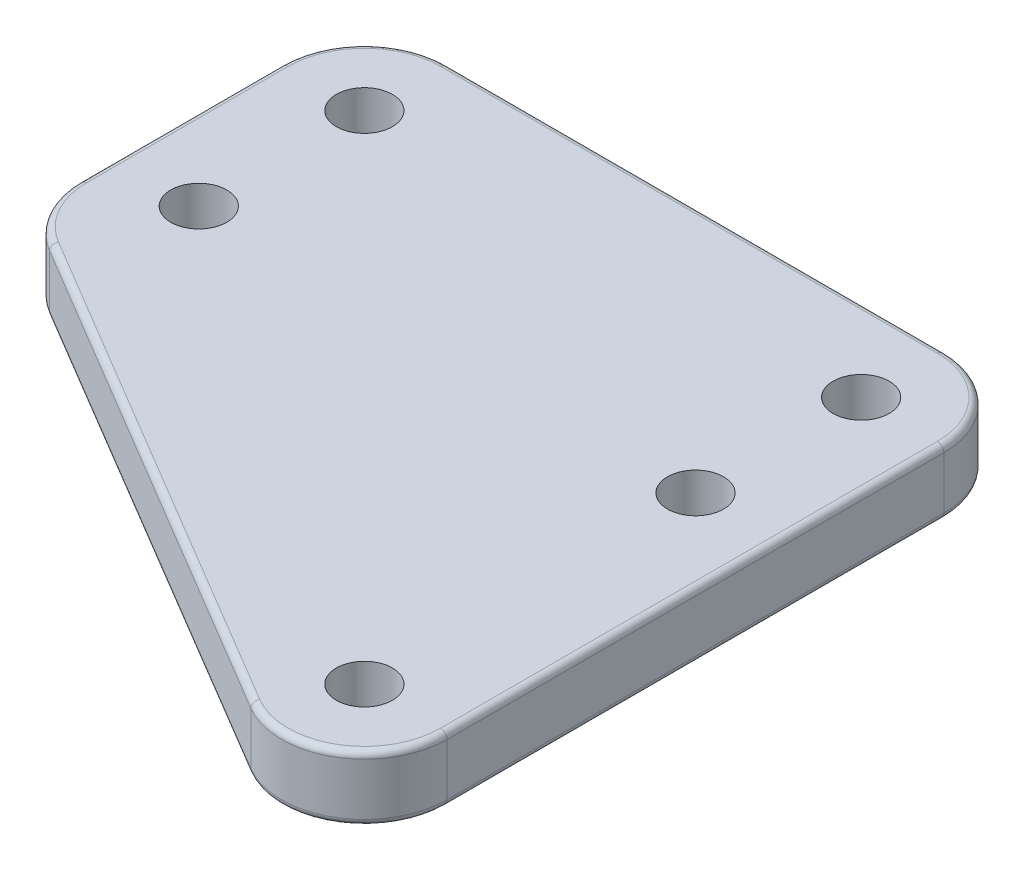
ISO-10303-21;
HEADER;
FILE_DESCRIPTION(('STEP AP214'),'2;1');
FILE_NAME('part.step','',(''),(''),'','','');
FILE_SCHEMA(('AUTOMOTIVE_DESIGN { 1 0 10303 214 1 1 1 1 }'));
ENDSEC;
DATA;
#1=APPLICATION_CONTEXT('core data for automotive mechanical design processes');
#2=APPLICATION_PROTOCOL_DEFINITION('international standard','automotive_design',2000,#1);
#3=PRODUCT_CONTEXT('',#1,'mechanical');
#4=PRODUCT('Part','Part','',(#3));
#5=PRODUCT_RELATED_PRODUCT_CATEGORY('part','',(#4));
#6=PRODUCT_DEFINITION_FORMATION('','',#4);
#7=PRODUCT_DEFINITION_CONTEXT('part definition',#1,'design');
#8=PRODUCT_DEFINITION('design','',#6,#7);
#9=PRODUCT_DEFINITION_SHAPE('','',#8);
#10=(LENGTH_UNIT() NAMED_UNIT(*) SI_UNIT(.MILLI.,.METRE.));
#11=(NAMED_UNIT(*) PLANE_ANGLE_UNIT() SI_UNIT($,.RADIAN.));
#12=(NAMED_UNIT(*) SI_UNIT($,.STERADIAN.) SOLID_ANGLE_UNIT());
#13=UNCERTAINTY_MEASURE_WITH_UNIT(LENGTH_MEASURE(1.E-05),#10,'distance_accuracy_value','');
#14=(GEOMETRIC_REPRESENTATION_CONTEXT(3) GLOBAL_UNCERTAINTY_ASSIGNED_CONTEXT((#13)) GLOBAL_UNIT_ASSIGNED_CONTEXT((#10,
#11,#12)) REPRESENTATION_CONTEXT('',''));
#15=CARTESIAN_POINT('',(0.,0.,0.));
#16=DIRECTION('',(0.,0.,1.));
#17=DIRECTION('',(1.,0.,0.));
#18=AXIS2_PLACEMENT_3D('',#15,#16,#17);
#19=CARTESIAN_POINT('',(0.,5.,0.));
#20=DIRECTION('',(0.,0.,1.));
#21=DIRECTION('',(1.,0.,0.));
#22=AXIS2_PLACEMENT_3D('',#19,#20,#21);
#23=PLANE('',#22);
#24=DIRECTION('',(0.,-1.,0.));
#25=VECTOR('',#24,1.);
#26=CARTESIAN_POINT('',(-6.35,0.,0.));
#27=LINE('',#26,#25);
#28=CARTESIAN_POINT('',(-6.35,4.5,0.));
#29=VERTEX_POINT('',#28);
#30=CARTESIAN_POINT('',(-6.35,0.5,0.));
#31=VERTEX_POINT('',#30);
#32=EDGE_CURVE('E297',#29,#31,#27,.T.);
#33=ORIENTED_EDGE('',*,*,#32,.T.);
#34=DIRECTION('',(-1.,0.,0.));
#35=VECTOR('',#34,1.);
#36=CARTESIAN_POINT('',(0.,0.5,0.));
#37=LINE('',#36,#35);
#38=CARTESIAN_POINT('',(-44.45,0.5,0.));
#39=VERTEX_POINT('',#38);
#40=EDGE_CURVE('E214',#31,#39,#37,.T.);
#41=ORIENTED_EDGE('',*,*,#40,.T.);
#42=DIRECTION('',(0.,-1.,0.));
#43=VECTOR('',#42,1.);
#44=CARTESIAN_POINT('',(-44.45,5.,0.));
#45=LINE('',#44,#43);
#46=CARTESIAN_POINT('',(-44.45,4.5,0.));
#47=VERTEX_POINT('',#46);
#48=EDGE_CURVE('E303',#39,#47,#45,.F.);
#49=ORIENTED_EDGE('',*,*,#48,.T.);
#50=DIRECTION('',(-1.,0.,0.));
#51=VECTOR('',#50,1.);
#52=CARTESIAN_POINT('',(-6.35,4.5,0.));
#53=LINE('',#52,#51);
#54=EDGE_CURVE('E212',#47,#29,#53,.F.);
#55=ORIENTED_EDGE('',*,*,#54,.T.);
#56=EDGE_LOOP('',(#33,#41,#49,#55));
#57=FACE_BOUND('',#56,.T.);
#58=ADVANCED_FACE('F40',(#57),#23,.F.);
#59=CARTESIAN_POINT('',(-50.8,5.,0.));
#60=DIRECTION('',(1.,0.,0.));
#61=DIRECTION('',(0.,0.,-1.));
#62=AXIS2_PLACEMENT_3D('',#59,#60,#61);
#63=PLANE('',#62);
#64=DIRECTION('',(0.,-1.,0.));
#65=VECTOR('',#64,1.);
#66=CARTESIAN_POINT('',(-50.8,5.,6.35));
#67=LINE('',#66,#65);
#68=CARTESIAN_POINT('',(-50.8,4.5,6.35));
#69=VERTEX_POINT('',#68);
#70=CARTESIAN_POINT('',(-50.8,0.5,6.35));
#71=VERTEX_POINT('',#70);
#72=EDGE_CURVE('E319',#69,#71,#67,.T.);
#73=ORIENTED_EDGE('',*,*,#72,.T.);
#74=DIRECTION('',(0.,0.,1.));
#75=VECTOR('',#74,1.);
#76=CARTESIAN_POINT('',(-50.8,0.5,0.));
#77=LINE('',#76,#75);
#78=CARTESIAN_POINT('',(-50.8,0.5,21.7885689170038));
#79=VERTEX_POINT('',#78);
#80=EDGE_CURVE('E206',#71,#79,#77,.T.);
#81=ORIENTED_EDGE('',*,*,#80,.T.);
#82=DIRECTION('',(0.,-1.,0.));
#83=VECTOR('',#82,1.);
#84=CARTESIAN_POINT('',(-50.8,5.,21.7885689170038));
#85=LINE('',#84,#83);
#86=CARTESIAN_POINT('',(-50.8,4.5,21.7885689170038));
#87=VERTEX_POINT('',#86);
#88=EDGE_CURVE('E316',#79,#87,#85,.F.);
#89=ORIENTED_EDGE('',*,*,#88,.T.);
#90=DIRECTION('',(0.,0.,1.));
#91=VECTOR('',#90,1.);
#92=CARTESIAN_POINT('',(-50.8,4.5,6.35));
#93=LINE('',#92,#91);
#94=EDGE_CURVE('E204',#87,#69,#93,.F.);
#95=ORIENTED_EDGE('',*,*,#94,.T.);
#96=EDGE_LOOP('',(#73,#81,#89,#95));
#97=FACE_BOUND('',#96,.T.);
#98=ADVANCED_FACE('F356',(#97),#63,.F.);
#99=CARTESIAN_POINT('',(-24.4348866044378,5.,41.0816587981342));
#100=DIRECTION('',(0.511198332858832,0.,-0.859462776670608));
#101=DIRECTION('',(-0.859462776670608,0.,-0.511198332858832));
#102=AXIS2_PLACEMENT_3D('',#99,#100,#101);
#103=PLANE('',#102);
#104=DIRECTION('',(0.,-1.,0.));
#105=VECTOR('',#104,1.);
#106=CARTESIAN_POINT('',(-47.6961094136536,5.,27.2461575488622));
#107=LINE('',#106,#105);
#108=CARTESIAN_POINT('',(-47.6961094136536,4.5,27.2461575488622));
#109=VERTEX_POINT('',#108);
#110=CARTESIAN_POINT('',(-47.6961094136536,0.5,27.2461575488622));
#111=VERTEX_POINT('',#110);
#112=EDGE_CURVE('E322',#109,#111,#107,.T.);
#113=ORIENTED_EDGE('',*,*,#112,.T.);
#114=DIRECTION('',(0.859462776670608,0.,0.511198332858832));
#115=VECTOR('',#114,1.);
#116=CARTESIAN_POINT('',(-24.4348866044378,0.5,41.0816587981342));
#117=LINE('',#116,#115);
#118=CARTESIAN_POINT('',(-9.59610941365358,0.5,49.9075886318584));
#119=VERTEX_POINT('',#118);
#120=EDGE_CURVE('E11',#111,#119,#117,.T.);
#121=ORIENTED_EDGE('',*,*,#120,.T.);
#122=DIRECTION('',(0.,-1.,0.));
#123=VECTOR('',#122,1.);
#124=CARTESIAN_POINT('',(-9.59610941365358,5.,49.9075886318584));
#125=LINE('',#124,#123);
#126=CARTESIAN_POINT('',(-9.59610941365358,4.5,49.9075886318584));
#127=VERTEX_POINT('',#126);
#128=EDGE_CURVE('E180',#119,#127,#125,.F.);
#129=ORIENTED_EDGE('',*,*,#128,.T.);
#130=DIRECTION('',(0.859462776670608,0.,0.511198332858832));
#131=VECTOR('',#130,1.);
#132=CARTESIAN_POINT('',(-47.6961094136536,4.5,27.2461575488622));
#133=LINE('',#132,#131);
#134=EDGE_CURVE('E49',#127,#109,#133,.F.);
#135=ORIENTED_EDGE('',*,*,#134,.T.);
#136=EDGE_LOOP('',(#113,#121,#129,#135));
#137=FACE_BOUND('',#136,.T.);
#138=ADVANCED_FACE('F366',(#137),#103,.F.);
#139=CARTESIAN_POINT('',(0.,5.,0.));
#140=DIRECTION('',(1.,0.,0.));
#141=DIRECTION('',(0.,0.,-1.));
#142=AXIS2_PLACEMENT_3D('',#139,#140,#141);
#143=PLANE('',#142);
#144=DIRECTION('',(0.,-1.,0.));
#145=VECTOR('',#144,1.);
#146=CARTESIAN_POINT('',(0.,5.,44.45));
#147=LINE('',#146,#145);
#148=CARTESIAN_POINT('',(0.,4.5,44.45));
#149=VERTEX_POINT('',#148);
#150=CARTESIAN_POINT('',(0.,0.5,44.45));
#151=VERTEX_POINT('',#150);
#152=EDGE_CURVE('E183',#149,#151,#147,.T.);
#153=ORIENTED_EDGE('',*,*,#152,.T.);
#154=DIRECTION('',(0.,0.,1.));
#155=VECTOR('',#154,1.);
#156=CARTESIAN_POINT('',(0.,0.5,6.35));
#157=LINE('',#156,#155);
#158=CARTESIAN_POINT('',(0.,0.5,6.35));
#159=VERTEX_POINT('',#158);
#160=EDGE_CURVE('E222',#151,#159,#157,.F.);
#161=ORIENTED_EDGE('',*,*,#160,.T.);
#162=DIRECTION('',(0.,-1.,0.));
#163=VECTOR('',#162,1.);
#164=CARTESIAN_POINT('',(0.,5.,6.35));
#165=LINE('',#164,#163);
#166=CARTESIAN_POINT('',(0.,4.5,6.35));
#167=VERTEX_POINT('',#166);
#168=EDGE_CURVE('E294',#159,#167,#165,.F.);
#169=ORIENTED_EDGE('',*,*,#168,.T.);
#170=DIRECTION('',(0.,0.,1.));
#171=VECTOR('',#170,1.);
#172=CARTESIAN_POINT('',(0.,4.5,0.));
#173=LINE('',#172,#171);
#174=EDGE_CURVE('E220',#167,#149,#173,.T.);
#175=ORIENTED_EDGE('',*,*,#174,.T.);
#176=EDGE_LOOP('',(#153,#161,#169,#175));
#177=FACE_BOUND('',#176,.T.);
#178=ADVANCED_FACE('F300',(#177),#143,.T.);
#179=CARTESIAN_POINT('',(-44.45,5.,6.35));
#180=DIRECTION('',(0.,-1.,0.));
#181=DIRECTION('',(0.,0.,-1.));
#182=AXIS2_PLACEMENT_3D('',#179,#180,#181);
#183=CYLINDRICAL_SURFACE('',#182,2.15);
#184=CARTESIAN_POINT('',(-44.45,5.,6.35));
#185=DIRECTION('',(0.,1.,0.));
#186=DIRECTION('',(0.,0.,1.));
#187=AXIS2_PLACEMENT_3D('',#184,#185,#186);
#188=CIRCLE('',#187,2.15);
#189=CARTESIAN_POINT('',(-44.45,5.,8.50000000000001));
#190=VERTEX_POINT('',#189);
#191=EDGE_CURVE('E309',#190,#190,#188,.T.);
#192=ORIENTED_EDGE('',*,*,#191,.T.);
#193=EDGE_LOOP('',(#192));
#194=FACE_BOUND('',#193,.T.);
#195=CARTESIAN_POINT('',(-44.45,0.,6.35));
#196=DIRECTION('',(0.,1.,0.));
#197=DIRECTION('',(0.,0.,1.));
#198=AXIS2_PLACEMENT_3D('',#195,#196,#197);
#199=CIRCLE('',#198,2.15);
#200=CARTESIAN_POINT('',(-44.45,0.,8.50000000000001));
#201=VERTEX_POINT('',#200);
#202=EDGE_CURVE('E642',#201,#201,#199,.T.);
#203=ORIENTED_EDGE('',*,*,#202,.F.);
#204=EDGE_LOOP('',(#203));
#205=FACE_BOUND('',#204,.T.);
#206=ADVANCED_FACE('F403',(#194,#205),#183,.F.);
#207=CARTESIAN_POINT('',(-6.34999999999999,5.,6.35));
#208=DIRECTION('',(0.,-1.,0.));
#209=DIRECTION('',(0.,0.,-1.));
#210=AXIS2_PLACEMENT_3D('',#207,#208,#209);
#211=CYLINDRICAL_SURFACE('',#210,2.15);
#212=CARTESIAN_POINT('',(-6.34999999999999,5.,6.35));
#213=DIRECTION('',(0.,1.,0.));
#214=DIRECTION('',(0.,0.,1.));
#215=AXIS2_PLACEMENT_3D('',#212,#213,#214);
#216=CIRCLE('',#215,2.15);
#217=CARTESIAN_POINT('',(-6.34999999999999,5.,8.50000000000001));
#218=VERTEX_POINT('',#217);
#219=EDGE_CURVE('E660',#218,#218,#216,.T.);
#220=ORIENTED_EDGE('',*,*,#219,.T.);
#221=EDGE_LOOP('',(#220));
#222=FACE_BOUND('',#221,.T.);
#223=CARTESIAN_POINT('',(-6.34999999999999,0.,6.35));
#224=DIRECTION('',(0.,1.,0.));
#225=DIRECTION('',(0.,0.,1.));
#226=AXIS2_PLACEMENT_3D('',#223,#224,#225);
#227=CIRCLE('',#226,2.15);
#228=CARTESIAN_POINT('',(-6.34999999999999,0.,8.50000000000001));
#229=VERTEX_POINT('',#228);
#230=EDGE_CURVE('E647',#229,#229,#227,.T.);
#231=ORIENTED_EDGE('',*,*,#230,.F.);
#232=EDGE_LOOP('',(#231));
#233=FACE_BOUND('',#232,.T.);
#234=ADVANCED_FACE('F406',(#222,#233),#211,.F.);
#235=CARTESIAN_POINT('',(-6.34999999999986,5.,19.05));
#236=DIRECTION('',(0.,-1.,0.));
#237=DIRECTION('',(0.,0.,-1.));
#238=AXIS2_PLACEMENT_3D('',#235,#236,#237);
#239=CYLINDRICAL_SURFACE('',#238,2.15);
#240=CARTESIAN_POINT('',(-6.34999999999986,5.,19.05));
#241=DIRECTION('',(0.,1.,0.));
#242=DIRECTION('',(0.,0.,1.));
#243=AXIS2_PLACEMENT_3D('',#240,#241,#242);
#244=CIRCLE('',#243,2.15);
#245=CARTESIAN_POINT('',(-6.34999999999986,5.,21.2));
#246=VERTEX_POINT('',#245);
#247=EDGE_CURVE('E644',#246,#246,#244,.T.);
#248=ORIENTED_EDGE('',*,*,#247,.T.);
#249=EDGE_LOOP('',(#248));
#250=FACE_BOUND('',#249,.T.);
#251=CARTESIAN_POINT('',(-6.34999999999986,0.,19.05));
#252=DIRECTION('',(0.,1.,0.));
#253=DIRECTION('',(0.,0.,1.));
#254=AXIS2_PLACEMENT_3D('',#251,#252,#253);
#255=CIRCLE('',#254,2.15);
#256=CARTESIAN_POINT('',(-6.34999999999986,0.,21.2));
#257=VERTEX_POINT('',#256);
#258=EDGE_CURVE('E651',#257,#257,#255,.T.);
#259=ORIENTED_EDGE('',*,*,#258,.F.);
#260=EDGE_LOOP('',(#259));
#261=FACE_BOUND('',#260,.T.);
#262=ADVANCED_FACE('F410',(#250,#261),#239,.F.);
#263=CARTESIAN_POINT('',(-44.4499999999999,5.,19.05));
#264=DIRECTION('',(0.,-1.,0.));
#265=DIRECTION('',(0.,0.,-1.));
#266=AXIS2_PLACEMENT_3D('',#263,#264,#265);
#267=CYLINDRICAL_SURFACE('',#266,2.15);
#268=CARTESIAN_POINT('',(-44.4499999999999,5.,19.05));
#269=DIRECTION('',(0.,1.,0.));
#270=DIRECTION('',(0.,0.,1.));
#271=AXIS2_PLACEMENT_3D('',#268,#269,#270);
#272=CIRCLE('',#271,2.15);
#273=CARTESIAN_POINT('',(-44.4499999999999,5.,21.2));
#274=VERTEX_POINT('',#273);
#275=EDGE_CURVE('E641',#274,#274,#272,.T.);
#276=ORIENTED_EDGE('',*,*,#275,.T.);
#277=EDGE_LOOP('',(#276));
#278=FACE_BOUND('',#277,.T.);
#279=CARTESIAN_POINT('',(-44.4499999999999,0.,19.05));
#280=DIRECTION('',(0.,1.,0.));
#281=DIRECTION('',(0.,0.,1.));
#282=AXIS2_PLACEMENT_3D('',#279,#280,#281);
#283=CIRCLE('',#282,2.15);
#284=CARTESIAN_POINT('',(-44.4499999999999,0.,21.2));
#285=VERTEX_POINT('',#284);
#286=EDGE_CURVE('E257',#285,#285,#283,.T.);
#287=ORIENTED_EDGE('',*,*,#286,.F.);
#288=EDGE_LOOP('',(#287));
#289=FACE_BOUND('',#288,.T.);
#290=ADVANCED_FACE('F414',(#278,#289),#267,.F.);
#291=CARTESIAN_POINT('',(-6.34999999999999,5.,44.45));
#292=DIRECTION('',(0.,-1.,0.));
#293=DIRECTION('',(0.,0.,-1.));
#294=AXIS2_PLACEMENT_3D('',#291,#292,#293);
#295=CYLINDRICAL_SURFACE('',#294,2.15);
#296=CARTESIAN_POINT('',(-6.34999999999999,5.,44.45));
#297=DIRECTION('',(0.,1.,0.));
#298=DIRECTION('',(0.,0.,1.));
#299=AXIS2_PLACEMENT_3D('',#296,#297,#298);
#300=CIRCLE('',#299,2.15);
#301=CARTESIAN_POINT('',(-6.34999999999999,5.,46.6));
#302=VERTEX_POINT('',#301);
#303=EDGE_CURVE('E304',#302,#302,#300,.T.);
#304=ORIENTED_EDGE('',*,*,#303,.T.);
#305=EDGE_LOOP('',(#304));
#306=FACE_BOUND('',#305,.T.);
#307=CARTESIAN_POINT('',(-6.34999999999999,0.,44.45));
#308=DIRECTION('',(0.,1.,0.));
#309=DIRECTION('',(0.,0.,1.));
#310=AXIS2_PLACEMENT_3D('',#307,#308,#309);
#311=CIRCLE('',#310,2.15);
#312=CARTESIAN_POINT('',(-6.34999999999999,0.,46.6));
#313=VERTEX_POINT('',#312);
#314=EDGE_CURVE('E312',#313,#313,#311,.T.);
#315=ORIENTED_EDGE('',*,*,#314,.F.);
#316=EDGE_LOOP('',(#315));
#317=FACE_BOUND('',#316,.T.);
#318=ADVANCED_FACE('F418',(#306,#317),#295,.F.);
#319=CARTESIAN_POINT('',(0.,5.,0.));
#320=DIRECTION('',(0.,1.,0.));
#321=DIRECTION('',(0.,0.,1.));
#322=AXIS2_PLACEMENT_3D('',#319,#320,#321);
#323=PLANE('',#322);
#324=DIRECTION('',(0.,0.,1.));
#325=VECTOR('',#324,1.);
#326=CARTESIAN_POINT('',(-50.3,5.,21.7885689170038));
#327=LINE('',#326,#325);
#328=CARTESIAN_POINT('',(-50.3,5.,6.35));
#329=VERTEX_POINT('',#328);
#330=CARTESIAN_POINT('',(-50.3,5.,21.7885689170038));
#331=VERTEX_POINT('',#330);
#332=EDGE_CURVE('E57',#329,#331,#327,.T.);
#333=ORIENTED_EDGE('',*,*,#332,.T.);
#334=CARTESIAN_POINT('',(-44.45,5.,21.7885689170038));
#335=DIRECTION('',(0.,1.,0.));
#336=DIRECTION('',(0.,0.,1.));
#337=AXIS2_PLACEMENT_3D('',#334,#335,#336);
#338=CIRCLE('',#337,5.85);
#339=CARTESIAN_POINT('',(-47.4405102472242,5.,26.8164261605269));
#340=VERTEX_POINT('',#339);
#341=EDGE_CURVE('E239',#331,#340,#338,.T.);
#342=ORIENTED_EDGE('',*,*,#341,.T.);
#343=DIRECTION('',(0.859462776670608,0.,0.511198332858832));
#344=VECTOR('',#343,1.);
#345=CARTESIAN_POINT('',(-9.34051024722416,5.,49.477857243523));
#346=LINE('',#345,#344);
#347=CARTESIAN_POINT('',(-9.34051024722416,5.,49.477857243523));
#348=VERTEX_POINT('',#347);
#349=EDGE_CURVE('E227',#340,#348,#346,.T.);
#350=ORIENTED_EDGE('',*,*,#349,.T.);
#351=CARTESIAN_POINT('',(-6.35,5.,44.45));
#352=DIRECTION('',(0.,1.,0.));
#353=DIRECTION('',(0.,0.,1.));
#354=AXIS2_PLACEMENT_3D('',#351,#352,#353);
#355=CIRCLE('',#354,5.85);
#356=CARTESIAN_POINT('',(-0.500000000000001,5.,44.45));
#357=VERTEX_POINT('',#356);
#358=EDGE_CURVE('E229',#348,#357,#355,.T.);
#359=ORIENTED_EDGE('',*,*,#358,.T.);
#360=DIRECTION('',(0.,0.,1.));
#361=VECTOR('',#360,1.);
#362=CARTESIAN_POINT('',(-0.5,5.,0.));
#363=LINE('',#362,#361);
#364=CARTESIAN_POINT('',(-0.5,5.,6.35));
#365=VERTEX_POINT('',#364);
#366=EDGE_CURVE('E231',#357,#365,#363,.F.);
#367=ORIENTED_EDGE('',*,*,#366,.T.);
#368=CARTESIAN_POINT('',(-6.35,5.,6.35));
#369=DIRECTION('',(0.,1.,0.));
#370=DIRECTION('',(0.,0.,1.));
#371=AXIS2_PLACEMENT_3D('',#368,#369,#370);
#372=CIRCLE('',#371,5.85);
#373=CARTESIAN_POINT('',(-6.35,5.,0.500000000000002));
#374=VERTEX_POINT('',#373);
#375=EDGE_CURVE('E233',#365,#374,#372,.T.);
#376=ORIENTED_EDGE('',*,*,#375,.T.);
#377=DIRECTION('',(-1.,0.,0.));
#378=VECTOR('',#377,1.);
#379=CARTESIAN_POINT('',(-44.45,5.,0.500000000000005));
#380=LINE('',#379,#378);
#381=CARTESIAN_POINT('',(-44.45,5.,0.500000000000005));
#382=VERTEX_POINT('',#381);
#383=EDGE_CURVE('E235',#374,#382,#380,.T.);
#384=ORIENTED_EDGE('',*,*,#383,.T.);
#385=CARTESIAN_POINT('',(-44.45,5.,6.35));
#386=DIRECTION('',(0.,1.,0.));
#387=DIRECTION('',(0.,0.,1.));
#388=AXIS2_PLACEMENT_3D('',#385,#386,#387);
#389=CIRCLE('',#388,5.85);
#390=EDGE_CURVE('E62',#382,#329,#389,.T.);
#391=ORIENTED_EDGE('',*,*,#390,.T.);
#392=EDGE_LOOP('',(#333,#342,#350,#359,#367,#376,#384,#391));
#393=FACE_BOUND('',#392,.T.);
#394=ORIENTED_EDGE('',*,*,#275,.F.);
#395=EDGE_LOOP('',(#394));
#396=FACE_BOUND('',#395,.T.);
#397=ORIENTED_EDGE('',*,*,#247,.F.);
#398=EDGE_LOOP('',(#397));
#399=FACE_BOUND('',#398,.T.);
#400=ORIENTED_EDGE('',*,*,#219,.F.);
#401=EDGE_LOOP('',(#400));
#402=FACE_BOUND('',#401,.T.);
#403=ORIENTED_EDGE('',*,*,#191,.F.);
#404=EDGE_LOOP('',(#403));
#405=FACE_BOUND('',#404,.T.);
#406=ORIENTED_EDGE('',*,*,#303,.F.);
#407=EDGE_LOOP('',(#406));
#408=FACE_BOUND('',#407,.T.);
#409=ADVANCED_FACE('F560',(#393,#396,#399,#402,#405,#408),#323,.T.);
#410=CARTESIAN_POINT('',(0.,0.,0.));
#411=DIRECTION('',(0.,1.,0.));
#412=DIRECTION('',(0.,0.,1.));
#413=AXIS2_PLACEMENT_3D('',#410,#411,#412);
#414=PLANE('',#413);
#415=DIRECTION('',(0.859462776670608,0.,0.511198332858832));
#416=VECTOR('',#415,1.);
#417=CARTESIAN_POINT('',(-24.1792874380084,0.,40.6519274097989));
#418=LINE('',#417,#416);
#419=CARTESIAN_POINT('',(-9.34051024722417,0.,49.4778572435231));
#420=VERTEX_POINT('',#419);
#421=CARTESIAN_POINT('',(-47.4405102472242,0.,26.8164261605269));
#422=VERTEX_POINT('',#421);
#423=EDGE_CURVE('E159',#420,#422,#418,.F.);
#424=ORIENTED_EDGE('',*,*,#423,.T.);
#425=CARTESIAN_POINT('',(-44.45,0.,21.7885689170038));
#426=DIRECTION('',(0.,1.,0.));
#427=DIRECTION('',(0.,0.,1.));
#428=AXIS2_PLACEMENT_3D('',#425,#426,#427);
#429=CIRCLE('',#428,5.85);
#430=CARTESIAN_POINT('',(-50.3,0.,21.7885689170038));
#431=VERTEX_POINT('',#430);
#432=EDGE_CURVE('E196',#422,#431,#429,.F.);
#433=ORIENTED_EDGE('',*,*,#432,.T.);
#434=DIRECTION('',(0.,0.,1.));
#435=VECTOR('',#434,1.);
#436=CARTESIAN_POINT('',(-50.3,0.,0.));
#437=LINE('',#436,#435);
#438=CARTESIAN_POINT('',(-50.3,0.,6.35));
#439=VERTEX_POINT('',#438);
#440=EDGE_CURVE('E194',#431,#439,#437,.F.);
#441=ORIENTED_EDGE('',*,*,#440,.T.);
#442=CARTESIAN_POINT('',(-44.45,0.,6.35));
#443=DIRECTION('',(0.,1.,0.));
#444=DIRECTION('',(0.,0.,1.));
#445=AXIS2_PLACEMENT_3D('',#442,#443,#444);
#446=CIRCLE('',#445,5.85);
#447=CARTESIAN_POINT('',(-44.45,0.,0.500000000000005));
#448=VERTEX_POINT('',#447);
#449=EDGE_CURVE('E192',#439,#448,#446,.F.);
#450=ORIENTED_EDGE('',*,*,#449,.T.);
#451=DIRECTION('',(-1.,0.,0.));
#452=VECTOR('',#451,1.);
#453=CARTESIAN_POINT('',(0.,0.,0.5));
#454=LINE('',#453,#452);
#455=CARTESIAN_POINT('',(-6.35,0.,0.500000000000002));
#456=VERTEX_POINT('',#455);
#457=EDGE_CURVE('E190',#448,#456,#454,.F.);
#458=ORIENTED_EDGE('',*,*,#457,.T.);
#459=CARTESIAN_POINT('',(-6.35,0.,6.35));
#460=DIRECTION('',(0.,1.,0.));
#461=DIRECTION('',(0.,0.,1.));
#462=AXIS2_PLACEMENT_3D('',#459,#460,#461);
#463=CIRCLE('',#462,5.85);
#464=CARTESIAN_POINT('',(-0.5,0.,6.35));
#465=VERTEX_POINT('',#464);
#466=EDGE_CURVE('E188',#456,#465,#463,.F.);
#467=ORIENTED_EDGE('',*,*,#466,.T.);
#468=DIRECTION('',(0.,0.,1.));
#469=VECTOR('',#468,1.);
#470=CARTESIAN_POINT('',(-0.500000000000001,0.,44.45));
#471=LINE('',#470,#469);
#472=CARTESIAN_POINT('',(-0.500000000000001,0.,44.45));
#473=VERTEX_POINT('',#472);
#474=EDGE_CURVE('E162',#465,#473,#471,.T.);
#475=ORIENTED_EDGE('',*,*,#474,.T.);
#476=CARTESIAN_POINT('',(-6.35,0.,44.45));
#477=DIRECTION('',(0.,1.,0.));
#478=DIRECTION('',(0.,0.,1.));
#479=AXIS2_PLACEMENT_3D('',#476,#477,#478);
#480=CIRCLE('',#479,5.85);
#481=EDGE_CURVE('E153',#473,#420,#480,.F.);
#482=ORIENTED_EDGE('',*,*,#481,.T.);
#483=EDGE_LOOP('',(#424,#433,#441,#450,#458,#467,#475,#482));
#484=FACE_BOUND('',#483,.T.);
#485=ORIENTED_EDGE('',*,*,#286,.T.);
#486=EDGE_LOOP('',(#485));
#487=FACE_BOUND('',#486,.T.);
#488=ORIENTED_EDGE('',*,*,#258,.T.);
#489=EDGE_LOOP('',(#488));
#490=FACE_BOUND('',#489,.T.);
#491=ORIENTED_EDGE('',*,*,#230,.T.);
#492=EDGE_LOOP('',(#491));
#493=FACE_BOUND('',#492,.T.);
#494=ORIENTED_EDGE('',*,*,#202,.T.);
#495=EDGE_LOOP('',(#494));
#496=FACE_BOUND('',#495,.T.);
#497=ORIENTED_EDGE('',*,*,#314,.T.);
#498=EDGE_LOOP('',(#497));
#499=FACE_BOUND('',#498,.T.);
#500=ADVANCED_FACE('F155',(#484,#487,#490,#493,#496,#499),#414,.F.);
#501=CARTESIAN_POINT('',(-6.35,5.,6.35));
#502=DIRECTION('',(0.,1.,0.));
#503=DIRECTION('',(0.,0.,1.));
#504=AXIS2_PLACEMENT_3D('',#501,#502,#503);
#505=CYLINDRICAL_SURFACE('',#504,6.35);
#506=ORIENTED_EDGE('',*,*,#168,.F.);
#507=CARTESIAN_POINT('',(-6.35,0.5,6.35));
#508=DIRECTION('',(0.,1.,0.));
#509=DIRECTION('',(0.,0.,1.));
#510=AXIS2_PLACEMENT_3D('',#507,#508,#509);
#511=CIRCLE('',#510,6.35);
#512=EDGE_CURVE('E218',#159,#31,#511,.T.);
#513=ORIENTED_EDGE('',*,*,#512,.T.);
#514=ORIENTED_EDGE('',*,*,#32,.F.);
#515=CARTESIAN_POINT('',(-6.35,4.5,6.35));
#516=DIRECTION('',(0.,1.,0.));
#517=DIRECTION('',(0.,0.,1.));
#518=AXIS2_PLACEMENT_3D('',#515,#516,#517);
#519=CIRCLE('',#518,6.35);
#520=EDGE_CURVE('E216',#29,#167,#519,.F.);
#521=ORIENTED_EDGE('',*,*,#520,.T.);
#522=EDGE_LOOP('',(#506,#513,#514,#521));
#523=FACE_BOUND('',#522,.T.);
#524=ADVANCED_FACE('F293',(#523),#505,.T.);
#525=CARTESIAN_POINT('',(-44.45,5.,6.35));
#526=DIRECTION('',(0.,-1.,0.));
#527=DIRECTION('',(0.,0.,-1.));
#528=AXIS2_PLACEMENT_3D('',#525,#526,#527);
#529=CYLINDRICAL_SURFACE('',#528,6.35);
#530=ORIENTED_EDGE('',*,*,#48,.F.);
#531=CARTESIAN_POINT('',(-44.45,0.5,6.35));
#532=DIRECTION('',(0.,1.,0.));
#533=DIRECTION('',(0.,0.,1.));
#534=AXIS2_PLACEMENT_3D('',#531,#532,#533);
#535=CIRCLE('',#534,6.35);
#536=EDGE_CURVE('E210',#39,#71,#535,.T.);
#537=ORIENTED_EDGE('',*,*,#536,.T.);
#538=ORIENTED_EDGE('',*,*,#72,.F.);
#539=CARTESIAN_POINT('',(-44.45,4.5,6.35));
#540=DIRECTION('',(0.,1.,0.));
#541=DIRECTION('',(0.,0.,1.));
#542=AXIS2_PLACEMENT_3D('',#539,#540,#541);
#543=CIRCLE('',#542,6.35);
#544=EDGE_CURVE('E208',#69,#47,#543,.F.);
#545=ORIENTED_EDGE('',*,*,#544,.T.);
#546=EDGE_LOOP('',(#530,#537,#538,#545));
#547=FACE_BOUND('',#546,.T.);
#548=ADVANCED_FACE('F338',(#547),#529,.T.);
#549=CARTESIAN_POINT('',(-44.45,5.,21.7885689170038));
#550=DIRECTION('',(0.,-1.,0.));
#551=DIRECTION('',(0.,0.,-1.));
#552=AXIS2_PLACEMENT_3D('',#549,#550,#551);
#553=CYLINDRICAL_SURFACE('',#552,6.35);
#554=ORIENTED_EDGE('',*,*,#88,.F.);
#555=CARTESIAN_POINT('',(-44.45,0.5,21.7885689170038));
#556=DIRECTION('',(0.,1.,0.));
#557=DIRECTION('',(0.,0.,1.));
#558=AXIS2_PLACEMENT_3D('',#555,#556,#557);
#559=CIRCLE('',#558,6.35);
#560=EDGE_CURVE('E201',#79,#111,#559,.T.);
#561=ORIENTED_EDGE('',*,*,#560,.T.);
#562=ORIENTED_EDGE('',*,*,#112,.F.);
#563=CARTESIAN_POINT('',(-44.45,4.5,21.7885689170038));
#564=DIRECTION('',(0.,1.,0.));
#565=DIRECTION('',(0.,0.,1.));
#566=AXIS2_PLACEMENT_3D('',#563,#564,#565);
#567=CIRCLE('',#566,6.35);
#568=EDGE_CURVE('E198',#109,#87,#567,.F.);
#569=ORIENTED_EDGE('',*,*,#568,.T.);
#570=EDGE_LOOP('',(#554,#561,#562,#569));
#571=FACE_BOUND('',#570,.T.);
#572=ADVANCED_FACE('F359',(#571),#553,.T.);
#573=CARTESIAN_POINT('',(-6.35,5.,44.45));
#574=DIRECTION('',(0.,1.,0.));
#575=DIRECTION('',(0.,0.,1.));
#576=AXIS2_PLACEMENT_3D('',#573,#574,#575);
#577=CYLINDRICAL_SURFACE('',#576,6.35);
#578=ORIENTED_EDGE('',*,*,#128,.F.);
#579=CARTESIAN_POINT('',(-6.35,0.5,44.45));
#580=DIRECTION('',(0.,1.,0.));
#581=DIRECTION('',(0.,0.,1.));
#582=AXIS2_PLACEMENT_3D('',#579,#580,#581);
#583=CIRCLE('',#582,6.35);
#584=EDGE_CURVE('E171',#119,#151,#583,.T.);
#585=ORIENTED_EDGE('',*,*,#584,.T.);
#586=ORIENTED_EDGE('',*,*,#152,.F.);
#587=CARTESIAN_POINT('',(-6.35,4.5,44.45));
#588=DIRECTION('',(0.,1.,0.));
#589=DIRECTION('',(0.,0.,1.));
#590=AXIS2_PLACEMENT_3D('',#587,#588,#589);
#591=CIRCLE('',#590,6.35);
#592=EDGE_CURVE('E224',#149,#127,#591,.F.);
#593=ORIENTED_EDGE('',*,*,#592,.T.);
#594=EDGE_LOOP('',(#578,#585,#586,#593));
#595=FACE_BOUND('',#594,.T.);
#596=ADVANCED_FACE('F368',(#595),#577,.T.);
#597=CARTESIAN_POINT('',(-6.35,0.5,6.35));
#598=DIRECTION('',(0.,1.,0.));
#599=DIRECTION('',(0.,0.,1.));
#600=AXIS2_PLACEMENT_3D('',#597,#598,#599);
#601=TOROIDAL_SURFACE('',#600,5.85,0.5);
#602=CARTESIAN_POINT('',(-6.35,0.5,0.500000000000001));
#603=DIRECTION('',(-1.,0.,0.));
#604=DIRECTION('',(0.,0.,1.));
#605=AXIS2_PLACEMENT_3D('',#602,#603,#604);
#606=CIRCLE('',#605,0.5);
#607=EDGE_CURVE('E251',#31,#456,#606,.T.);
#608=ORIENTED_EDGE('',*,*,#607,.F.);
#609=ORIENTED_EDGE('',*,*,#512,.F.);
#610=CARTESIAN_POINT('',(-0.5,0.5,6.35));
#611=DIRECTION('',(0.,0.,1.));
#612=DIRECTION('',(1.,0.,0.));
#613=AXIS2_PLACEMENT_3D('',#610,#611,#612);
#614=CIRCLE('',#613,0.5);
#615=EDGE_CURVE('E254',#465,#159,#614,.T.);
#616=ORIENTED_EDGE('',*,*,#615,.F.);
#617=ORIENTED_EDGE('',*,*,#466,.F.);
#618=EDGE_LOOP('',(#608,#609,#616,#617));
#619=FACE_BOUND('',#618,.T.);
#620=ADVANCED_FACE('F332',(#619),#601,.T.);
#621=CARTESIAN_POINT('',(-0.5,0.5,0.));
#622=DIRECTION('',(0.,0.,-1.));
#623=DIRECTION('',(-1.,0.,0.));
#624=AXIS2_PLACEMENT_3D('',#621,#622,#623);
#625=CYLINDRICAL_SURFACE('',#624,0.5);
#626=ORIENTED_EDGE('',*,*,#615,.T.);
#627=ORIENTED_EDGE('',*,*,#160,.F.);
#628=CARTESIAN_POINT('',(-0.500000000000001,0.5,44.45));
#629=DIRECTION('',(0.,0.,1.));
#630=DIRECTION('',(1.,0.,0.));
#631=AXIS2_PLACEMENT_3D('',#628,#629,#630);
#632=CIRCLE('',#631,0.5);
#633=EDGE_CURVE('E249',#473,#151,#632,.T.);
#634=ORIENTED_EDGE('',*,*,#633,.F.);
#635=ORIENTED_EDGE('',*,*,#474,.F.);
#636=EDGE_LOOP('',(#626,#627,#634,#635));
#637=FACE_BOUND('',#636,.T.);
#638=ADVANCED_FACE('F327',(#637),#625,.T.);
#639=CARTESIAN_POINT('',(0.,0.5,0.5));
#640=DIRECTION('',(-1.,0.,0.));
#641=DIRECTION('',(0.,0.,1.));
#642=AXIS2_PLACEMENT_3D('',#639,#640,#641);
#643=CYLINDRICAL_SURFACE('',#642,0.5);
#644=ORIENTED_EDGE('',*,*,#607,.T.);
#645=ORIENTED_EDGE('',*,*,#457,.F.);
#646=CARTESIAN_POINT('',(-44.45,0.5,0.500000000000005));
#647=DIRECTION('',(-1.,0.,0.));
#648=DIRECTION('',(0.,0.,1.));
#649=AXIS2_PLACEMENT_3D('',#646,#647,#648);
#650=CIRCLE('',#649,0.5);
#651=EDGE_CURVE('E174',#39,#448,#650,.T.);
#652=ORIENTED_EDGE('',*,*,#651,.F.);
#653=ORIENTED_EDGE('',*,*,#40,.F.);
#654=EDGE_LOOP('',(#644,#645,#652,#653));
#655=FACE_BOUND('',#654,.T.);
#656=ADVANCED_FACE('F344',(#655),#643,.T.);
#657=CARTESIAN_POINT('',(-6.35,0.5,44.45));
#658=DIRECTION('',(0.,1.,0.));
#659=DIRECTION('',(0.,0.,1.));
#660=AXIS2_PLACEMENT_3D('',#657,#658,#659);
#661=TOROIDAL_SURFACE('',#660,5.85,0.5);
#662=ORIENTED_EDGE('',*,*,#633,.T.);
#663=ORIENTED_EDGE('',*,*,#584,.F.);
#664=CARTESIAN_POINT('',(-9.34051024722417,0.5,49.4778572435231));
#665=DIRECTION('',(-0.859462776670608,0.,-0.511198332858832));
#666=DIRECTION('',(-0.511198332858832,0.,0.859462776670608));
#667=AXIS2_PLACEMENT_3D('',#664,#665,#666);
#668=CIRCLE('',#667,0.5);
#669=EDGE_CURVE('E169',#420,#119,#668,.T.);
#670=ORIENTED_EDGE('',*,*,#669,.F.);
#671=ORIENTED_EDGE('',*,*,#481,.F.);
#672=EDGE_LOOP('',(#662,#663,#670,#671));
#673=FACE_BOUND('',#672,.T.);
#674=ADVANCED_FACE('F170',(#673),#661,.T.);
#675=CARTESIAN_POINT('',(-44.45,0.5,6.35));
#676=DIRECTION('',(0.,1.,0.));
#677=DIRECTION('',(0.,0.,1.));
#678=AXIS2_PLACEMENT_3D('',#675,#676,#677);
#679=TOROIDAL_SURFACE('',#678,5.85,0.5);
#680=ORIENTED_EDGE('',*,*,#651,.T.);
#681=ORIENTED_EDGE('',*,*,#449,.F.);
#682=CARTESIAN_POINT('',(-50.3,0.5,6.35));
#683=DIRECTION('',(0.,0.,1.));
#684=DIRECTION('',(1.,0.,0.));
#685=AXIS2_PLACEMENT_3D('',#682,#683,#684);
#686=CIRCLE('',#685,0.5);
#687=EDGE_CURVE('E175',#71,#439,#686,.T.);
#688=ORIENTED_EDGE('',*,*,#687,.F.);
#689=ORIENTED_EDGE('',*,*,#536,.F.);
#690=EDGE_LOOP('',(#680,#681,#688,#689));
#691=FACE_BOUND('',#690,.T.);
#692=ADVANCED_FACE('F348',(#691),#679,.T.);
#693=CARTESIAN_POINT('',(-24.1792874380084,0.5,40.6519274097989));
#694=DIRECTION('',(0.859462776670608,0.,0.511198332858832));
#695=DIRECTION('',(0.511198332858832,0.,-0.859462776670608));
#696=AXIS2_PLACEMENT_3D('',#693,#694,#695);
#697=CYLINDRICAL_SURFACE('',#696,0.5);
#698=ORIENTED_EDGE('',*,*,#669,.T.);
#699=ORIENTED_EDGE('',*,*,#120,.F.);
#700=CARTESIAN_POINT('',(-47.4405102472242,0.5,26.8164261605269));
#701=DIRECTION('',(-0.859462776670611,0.,-0.511198332858826));
#702=DIRECTION('',(-0.511198332858826,0.,0.859462776670611));
#703=AXIS2_PLACEMENT_3D('',#700,#701,#702);
#704=CIRCLE('',#703,0.5);
#705=EDGE_CURVE('E178',#422,#111,#704,.T.);
#706=ORIENTED_EDGE('',*,*,#705,.F.);
#707=ORIENTED_EDGE('',*,*,#423,.F.);
#708=EDGE_LOOP('',(#698,#699,#706,#707));
#709=FACE_BOUND('',#708,.T.);
#710=ADVANCED_FACE('F177',(#709),#697,.T.);
#711=CARTESIAN_POINT('',(-50.3,0.5,0.));
#712=DIRECTION('',(0.,0.,1.));
#713=DIRECTION('',(1.,0.,0.));
#714=AXIS2_PLACEMENT_3D('',#711,#712,#713);
#715=CYLINDRICAL_SURFACE('',#714,0.5);
#716=ORIENTED_EDGE('',*,*,#687,.T.);
#717=ORIENTED_EDGE('',*,*,#440,.F.);
#718=CARTESIAN_POINT('',(-50.3,0.5,21.7885689170038));
#719=DIRECTION('',(0.,0.,1.));
#720=DIRECTION('',(1.,0.,0.));
#721=AXIS2_PLACEMENT_3D('',#718,#719,#720);
#722=CIRCLE('',#721,0.5);
#723=EDGE_CURVE('E242',#79,#431,#722,.T.);
#724=ORIENTED_EDGE('',*,*,#723,.F.);
#725=ORIENTED_EDGE('',*,*,#80,.F.);
#726=EDGE_LOOP('',(#716,#717,#724,#725));
#727=FACE_BOUND('',#726,.T.);
#728=ADVANCED_FACE('F353',(#727),#715,.T.);
#729=CARTESIAN_POINT('',(-44.45,0.5,21.7885689170038));
#730=DIRECTION('',(0.,1.,0.));
#731=DIRECTION('',(0.,0.,1.));
#732=AXIS2_PLACEMENT_3D('',#729,#730,#731);
#733=TOROIDAL_SURFACE('',#732,5.85,0.5);
#734=ORIENTED_EDGE('',*,*,#705,.T.);
#735=ORIENTED_EDGE('',*,*,#560,.F.);
#736=ORIENTED_EDGE('',*,*,#723,.T.);
#737=ORIENTED_EDGE('',*,*,#432,.F.);
#738=EDGE_LOOP('',(#734,#735,#736,#737));
#739=FACE_BOUND('',#738,.T.);
#740=ADVANCED_FACE('F363',(#739),#733,.T.);
#741=CARTESIAN_POINT('',(-6.35,4.5,6.35));
#742=DIRECTION('',(0.,1.,0.));
#743=DIRECTION('',(0.,0.,1.));
#744=AXIS2_PLACEMENT_3D('',#741,#742,#743);
#745=TOROIDAL_SURFACE('',#744,5.85,0.5);
#746=CARTESIAN_POINT('',(-0.5,4.5,6.35));
#747=DIRECTION('',(0.,0.,1.));
#748=DIRECTION('',(1.,0.,0.));
#749=AXIS2_PLACEMENT_3D('',#746,#747,#748);
#750=CIRCLE('',#749,0.5);
#751=EDGE_CURVE('E273',#167,#365,#750,.T.);
#752=ORIENTED_EDGE('',*,*,#751,.F.);
#753=ORIENTED_EDGE('',*,*,#520,.F.);
#754=CARTESIAN_POINT('',(-6.35,4.5,0.500000000000002));
#755=DIRECTION('',(-1.,0.,0.));
#756=DIRECTION('',(0.,0.,1.));
#757=AXIS2_PLACEMENT_3D('',#754,#755,#756);
#758=CIRCLE('',#757,0.5);
#759=EDGE_CURVE('E44',#374,#29,#758,.T.);
#760=ORIENTED_EDGE('',*,*,#759,.F.);
#761=ORIENTED_EDGE('',*,*,#375,.F.);
#762=EDGE_LOOP('',(#752,#753,#760,#761));
#763=FACE_BOUND('',#762,.T.);
#764=ADVANCED_FACE('F42',(#763),#745,.T.);
#765=CARTESIAN_POINT('',(0.,4.5,0.5));
#766=DIRECTION('',(1.,0.,0.));
#767=DIRECTION('',(0.,0.,-1.));
#768=AXIS2_PLACEMENT_3D('',#765,#766,#767);
#769=CYLINDRICAL_SURFACE('',#768,0.5);
#770=ORIENTED_EDGE('',*,*,#759,.T.);
#771=ORIENTED_EDGE('',*,*,#54,.F.);
#772=CARTESIAN_POINT('',(-44.45,4.5,0.500000000000005));
#773=DIRECTION('',(-1.,0.,0.));
#774=DIRECTION('',(0.,0.,1.));
#775=AXIS2_PLACEMENT_3D('',#772,#773,#774);
#776=CIRCLE('',#775,0.5);
#777=EDGE_CURVE('E271',#382,#47,#776,.T.);
#778=ORIENTED_EDGE('',*,*,#777,.F.);
#779=ORIENTED_EDGE('',*,*,#383,.F.);
#780=EDGE_LOOP('',(#770,#771,#778,#779));
#781=FACE_BOUND('',#780,.T.);
#782=ADVANCED_FACE('F284',(#781),#769,.T.);
#783=CARTESIAN_POINT('',(-0.5,4.5,0.));
#784=DIRECTION('',(0.,0.,1.));
#785=DIRECTION('',(1.,0.,0.));
#786=AXIS2_PLACEMENT_3D('',#783,#784,#785);
#787=CYLINDRICAL_SURFACE('',#786,0.5);
#788=ORIENTED_EDGE('',*,*,#751,.T.);
#789=ORIENTED_EDGE('',*,*,#366,.F.);
#790=CARTESIAN_POINT('',(-0.500000000000001,4.5,44.45));
#791=DIRECTION('',(0.,0.,1.));
#792=DIRECTION('',(1.,0.,0.));
#793=AXIS2_PLACEMENT_3D('',#790,#791,#792);
#794=CIRCLE('',#793,0.5);
#795=EDGE_CURVE('E268',#149,#357,#794,.T.);
#796=ORIENTED_EDGE('',*,*,#795,.F.);
#797=ORIENTED_EDGE('',*,*,#174,.F.);
#798=EDGE_LOOP('',(#788,#789,#796,#797));
#799=FACE_BOUND('',#798,.T.);
#800=ADVANCED_FACE('F387',(#799),#787,.T.);
#801=CARTESIAN_POINT('',(-44.45,4.5,6.35));
#802=DIRECTION('',(0.,1.,0.));
#803=DIRECTION('',(0.,0.,1.));
#804=AXIS2_PLACEMENT_3D('',#801,#802,#803);
#805=TOROIDAL_SURFACE('',#804,5.85,0.5);
#806=ORIENTED_EDGE('',*,*,#777,.T.);
#807=ORIENTED_EDGE('',*,*,#544,.F.);
#808=CARTESIAN_POINT('',(-50.3,4.5,6.35));
#809=DIRECTION('',(0.,0.,1.));
#810=DIRECTION('',(1.,0.,0.));
#811=AXIS2_PLACEMENT_3D('',#808,#809,#810);
#812=CIRCLE('',#811,0.5);
#813=EDGE_CURVE('E265',#329,#69,#812,.T.);
#814=ORIENTED_EDGE('',*,*,#813,.F.);
#815=ORIENTED_EDGE('',*,*,#390,.F.);
#816=EDGE_LOOP('',(#806,#807,#814,#815));
#817=FACE_BOUND('',#816,.T.);
#818=ADVANCED_FACE('F385',(#817),#805,.T.);
#819=CARTESIAN_POINT('',(-6.35,4.5,44.45));
#820=DIRECTION('',(0.,1.,0.));
#821=DIRECTION('',(0.,0.,1.));
#822=AXIS2_PLACEMENT_3D('',#819,#820,#821);
#823=TOROIDAL_SURFACE('',#822,5.85,0.5);
#824=ORIENTED_EDGE('',*,*,#795,.T.);
#825=ORIENTED_EDGE('',*,*,#358,.F.);
#826=CARTESIAN_POINT('',(-9.34051024722417,4.5,49.4778572435231));
#827=DIRECTION('',(-0.859462776670608,0.,-0.511198332858832));
#828=DIRECTION('',(-0.511198332858832,0.,0.859462776670608));
#829=AXIS2_PLACEMENT_3D('',#826,#827,#828);
#830=CIRCLE('',#829,0.5);
#831=EDGE_CURVE('E262',#127,#348,#830,.T.);
#832=ORIENTED_EDGE('',*,*,#831,.F.);
#833=ORIENTED_EDGE('',*,*,#592,.F.);
#834=EDGE_LOOP('',(#824,#825,#832,#833));
#835=FACE_BOUND('',#834,.T.);
#836=ADVANCED_FACE('F371',(#835),#823,.T.);
#837=CARTESIAN_POINT('',(-50.3,4.5,0.));
#838=DIRECTION('',(0.,0.,-1.));
#839=DIRECTION('',(-1.,0.,0.));
#840=AXIS2_PLACEMENT_3D('',#837,#838,#839);
#841=CYLINDRICAL_SURFACE('',#840,0.5);
#842=ORIENTED_EDGE('',*,*,#813,.T.);
#843=ORIENTED_EDGE('',*,*,#94,.F.);
#844=CARTESIAN_POINT('',(-50.3,4.5,21.7885689170038));
#845=DIRECTION('',(0.,0.,1.));
#846=DIRECTION('',(1.,0.,0.));
#847=AXIS2_PLACEMENT_3D('',#844,#845,#846);
#848=CIRCLE('',#847,0.5);
#849=EDGE_CURVE('E260',#331,#87,#848,.T.);
#850=ORIENTED_EDGE('',*,*,#849,.F.);
#851=ORIENTED_EDGE('',*,*,#332,.F.);
#852=EDGE_LOOP('',(#842,#843,#850,#851));
#853=FACE_BOUND('',#852,.T.);
#854=ADVANCED_FACE('F383',(#853),#841,.T.);
#855=CARTESIAN_POINT('',(-24.1792874380084,4.5,40.6519274097989));
#856=DIRECTION('',(-0.859462776670608,0.,-0.511198332858832));
#857=DIRECTION('',(-0.511198332858832,0.,0.859462776670608));
#858=AXIS2_PLACEMENT_3D('',#855,#856,#857);
#859=CYLINDRICAL_SURFACE('',#858,0.5);
#860=ORIENTED_EDGE('',*,*,#831,.T.);
#861=ORIENTED_EDGE('',*,*,#349,.F.);
#862=CARTESIAN_POINT('',(-47.4405102472242,4.5,26.8164261605269));
#863=DIRECTION('',(-0.859462776670609,0.,-0.511198332858829));
#864=DIRECTION('',(-0.511198332858829,0.,0.85946277667061));
#865=AXIS2_PLACEMENT_3D('',#862,#863,#864);
#866=CIRCLE('',#865,0.5);
#867=EDGE_CURVE('E258',#109,#340,#866,.T.);
#868=ORIENTED_EDGE('',*,*,#867,.F.);
#869=ORIENTED_EDGE('',*,*,#134,.F.);
#870=EDGE_LOOP('',(#860,#861,#868,#869));
#871=FACE_BOUND('',#870,.T.);
#872=ADVANCED_FACE('F377',(#871),#859,.T.);
#873=CARTESIAN_POINT('',(-44.45,4.5,21.7885689170038));
#874=DIRECTION('',(0.,1.,0.));
#875=DIRECTION('',(0.,0.,1.));
#876=AXIS2_PLACEMENT_3D('',#873,#874,#875);
#877=TOROIDAL_SURFACE('',#876,5.85,0.5);
#878=ORIENTED_EDGE('',*,*,#849,.T.);
#879=ORIENTED_EDGE('',*,*,#568,.F.);
#880=ORIENTED_EDGE('',*,*,#867,.T.);
#881=ORIENTED_EDGE('',*,*,#341,.F.);
#882=EDGE_LOOP('',(#878,#879,#880,#881));
#883=FACE_BOUND('',#882,.T.);
#884=ADVANCED_FACE('F379',(#883),#877,.T.);
#885=CLOSED_SHELL('',(#58,#98,#138,#178,#206,#234,#262,#290,#318,#409,#500,#524,#548,#572,#596,
#620,#638,#656,#674,#692,#710,#728,#740,#764,#782,#800,#818,#836,#854,#872,#884));
#886=MANIFOLD_SOLID_BREP('B2',#885);
#887=ADVANCED_BREP_SHAPE_REPRESENTATION('',(#18,#886),#14);
#888=SHAPE_DEFINITION_REPRESENTATION(#9,#887);
ENDSEC;
END-ISO-10303-21;
